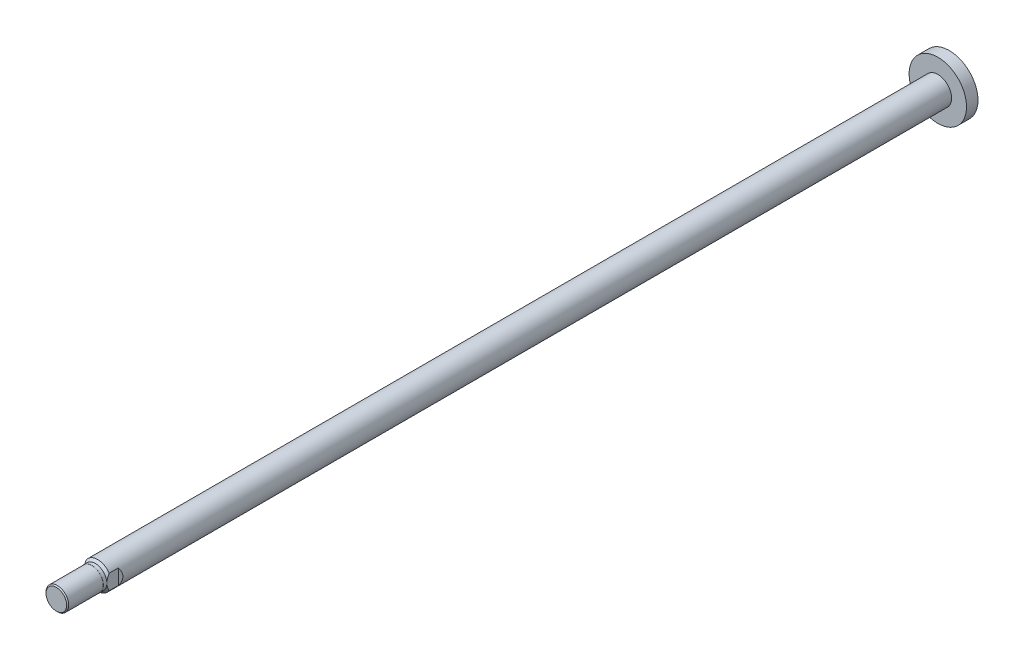
ISO-10303-21;
HEADER;
FILE_DESCRIPTION(('STEP AP214'),'2;1');
FILE_NAME('part.step','',(''),(''),'','','');
FILE_SCHEMA(('AUTOMOTIVE_DESIGN { 1 0 10303 214 1 1 1 1 }'));
ENDSEC;
DATA;
#1=APPLICATION_CONTEXT('core data for automotive mechanical design processes');
#2=APPLICATION_PROTOCOL_DEFINITION('international standard','automotive_design',2000,#1);
#3=PRODUCT_CONTEXT('',#1,'mechanical');
#4=PRODUCT('Part','Part','',(#3));
#5=PRODUCT_RELATED_PRODUCT_CATEGORY('part','',(#4));
#6=PRODUCT_DEFINITION_FORMATION('','',#4);
#7=PRODUCT_DEFINITION_CONTEXT('part definition',#1,'design');
#8=PRODUCT_DEFINITION('design','',#6,#7);
#9=PRODUCT_DEFINITION_SHAPE('','',#8);
#10=(LENGTH_UNIT() NAMED_UNIT(*) SI_UNIT(.MILLI.,.METRE.));
#11=(NAMED_UNIT(*) PLANE_ANGLE_UNIT() SI_UNIT($,.RADIAN.));
#12=(NAMED_UNIT(*) SI_UNIT($,.STERADIAN.) SOLID_ANGLE_UNIT());
#13=UNCERTAINTY_MEASURE_WITH_UNIT(LENGTH_MEASURE(1.E-05),#10,'distance_accuracy_value','');
#14=(GEOMETRIC_REPRESENTATION_CONTEXT(3) GLOBAL_UNCERTAINTY_ASSIGNED_CONTEXT((#13)) GLOBAL_UNIT_ASSIGNED_CONTEXT((#10,
#11,#12)) REPRESENTATION_CONTEXT('',''));
#15=CARTESIAN_POINT('',(0.,0.,0.));
#16=DIRECTION('',(0.,0.,1.));
#17=DIRECTION('',(1.,0.,0.));
#18=AXIS2_PLACEMENT_3D('',#15,#16,#17);
#19=CARTESIAN_POINT('',(0.,0.,371.));
#20=DIRECTION('',(0.,0.,1.));
#21=DIRECTION('',(1.,0.,0.));
#22=AXIS2_PLACEMENT_3D('',#19,#20,#21);
#23=CYLINDRICAL_SURFACE('',#22,5.);
#24=CARTESIAN_POINT('',(0.,0.,372.));
#25=DIRECTION('',(0.,0.,1.));
#26=DIRECTION('',(1.,0.,0.));
#27=AXIS2_PLACEMENT_3D('',#24,#25,#26);
#28=CIRCLE('',#27,5.);
#29=CARTESIAN_POINT('',(5.,0.,372.));
#30=VERTEX_POINT('',#29);
#31=CARTESIAN_POINT('',(-5.,0.,372.));
#32=VERTEX_POINT('',#31);
#33=EDGE_CURVE('E123',#30,#32,#28,.T.);
#34=ORIENTED_EDGE('',*,*,#33,.T.);
#35=EDGE_CURVE('E120',#32,#30,#28,.T.);
#36=ORIENTED_EDGE('',*,*,#35,.T.);
#37=EDGE_LOOP('',(#34,#36));
#38=FACE_BOUND('',#37,.T.);
#39=CARTESIAN_POINT('',(0.,0.,373.5));
#40=DIRECTION('',(0.,0.,1.));
#41=DIRECTION('',(1.,0.,0.));
#42=AXIS2_PLACEMENT_3D('',#39,#40,#41);
#43=CIRCLE('',#42,5.);
#44=CARTESIAN_POINT('',(5.,0.,373.5));
#45=VERTEX_POINT('',#44);
#46=EDGE_CURVE('E295',#45,#45,#43,.T.);
#47=ORIENTED_EDGE('',*,*,#46,.F.);
#48=EDGE_LOOP('',(#47));
#49=FACE_BOUND('',#48,.T.);
#50=ADVANCED_FACE('F36',(#38,#49),#23,.T.);
#51=CARTESIAN_POINT('',(0.,0.,389.));
#52=DIRECTION('',(0.,0.,-1.));
#53=DIRECTION('',(-1.,0.,0.));
#54=AXIS2_PLACEMENT_3D('',#51,#52,#53);
#55=CYLINDRICAL_SURFACE('',#54,6.);
#56=CARTESIAN_POINT('',(0.,0.,5.));
#57=DIRECTION('',(0.,0.,1.));
#58=DIRECTION('',(1.,0.,0.));
#59=AXIS2_PLACEMENT_3D('',#56,#57,#58);
#60=CIRCLE('',#59,6.);
#61=CARTESIAN_POINT('',(6.,0.,5.));
#62=VERTEX_POINT('',#61);
#63=EDGE_CURVE('E113',#62,#62,#60,.F.);
#64=ORIENTED_EDGE('',*,*,#63,.F.);
#65=EDGE_LOOP('',(#64));
#66=FACE_BOUND('',#65,.T.);
#67=CARTESIAN_POINT('',(0.,0.,372.));
#68=DIRECTION('',(-0.707106781186547,0.,0.707106781186547));
#69=DIRECTION('',(-0.707106781186548,0.,-0.707106781186548));
#70=AXIS2_PLACEMENT_3D('',#67,#68,#69);
#71=ELLIPSE('',#70,8.48528137423857,6.);
#72=CARTESIAN_POINT('',(-5.,3.3166247903554,367.));
#73=VERTEX_POINT('',#72);
#74=CARTESIAN_POINT('',(-5.,-3.3166247903554,367.));
#75=VERTEX_POINT('',#74);
#76=EDGE_CURVE('E45',#73,#75,#71,.T.);
#77=ORIENTED_EDGE('',*,*,#76,.F.);
#78=DIRECTION('',(0.,0.,-1.));
#79=VECTOR('',#78,1.);
#80=CARTESIAN_POINT('',(-5.,3.3166247903554,389.));
#81=LINE('',#80,#79);
#82=CARTESIAN_POINT('',(-5.,3.3166247903554,371.));
#83=VERTEX_POINT('',#82);
#84=EDGE_CURVE('E95',#83,#73,#81,.T.);
#85=ORIENTED_EDGE('',*,*,#84,.F.);
#86=CARTESIAN_POINT('',(0.,0.,371.));
#87=DIRECTION('',(0.,0.,1.));
#88=DIRECTION('',(1.,0.,0.));
#89=AXIS2_PLACEMENT_3D('',#86,#87,#88);
#90=CIRCLE('',#89,6.);
#91=CARTESIAN_POINT('',(5.,3.3166247903554,371.));
#92=VERTEX_POINT('',#91);
#93=EDGE_CURVE('E110',#92,#83,#90,.T.);
#94=ORIENTED_EDGE('',*,*,#93,.F.);
#95=DIRECTION('',(0.,0.,-1.));
#96=VECTOR('',#95,1.);
#97=CARTESIAN_POINT('',(5.,3.3166247903554,389.));
#98=LINE('',#97,#96);
#99=CARTESIAN_POINT('',(5.,3.31662479035539,367.));
#100=VERTEX_POINT('',#99);
#101=EDGE_CURVE('E60',#92,#100,#98,.T.);
#102=ORIENTED_EDGE('',*,*,#101,.T.);
#103=CARTESIAN_POINT('',(0.,0.,372.));
#104=DIRECTION('',(-0.707106781186547,0.,-0.707106781186547));
#105=DIRECTION('',(0.707106781186548,0.,-0.707106781186548));
#106=AXIS2_PLACEMENT_3D('',#103,#104,#105);
#107=ELLIPSE('',#106,8.48528137423857,6.);
#108=CARTESIAN_POINT('',(5.,-3.3166247903554,367.));
#109=VERTEX_POINT('',#108);
#110=EDGE_CURVE('E134',#100,#109,#107,.T.);
#111=ORIENTED_EDGE('',*,*,#110,.T.);
#112=DIRECTION('',(0.,0.,-1.));
#113=VECTOR('',#112,1.);
#114=CARTESIAN_POINT('',(5.,-3.3166247903554,389.));
#115=LINE('',#114,#113);
#116=CARTESIAN_POINT('',(5.,-3.3166247903554,371.));
#117=VERTEX_POINT('',#116);
#118=EDGE_CURVE('E107',#109,#117,#115,.F.);
#119=ORIENTED_EDGE('',*,*,#118,.T.);
#120=CARTESIAN_POINT('',(-5.,-3.3166247903554,371.));
#121=VERTEX_POINT('',#120);
#122=EDGE_CURVE('E100',#121,#117,#90,.T.);
#123=ORIENTED_EDGE('',*,*,#122,.F.);
#124=DIRECTION('',(0.,0.,-1.));
#125=VECTOR('',#124,1.);
#126=CARTESIAN_POINT('',(-5.,-3.3166247903554,389.));
#127=LINE('',#126,#125);
#128=EDGE_CURVE('E94',#75,#121,#127,.F.);
#129=ORIENTED_EDGE('',*,*,#128,.F.);
#130=EDGE_LOOP('',(#77,#85,#94,#102,#111,#119,#123,#129));
#131=FACE_BOUND('',#130,.T.);
#132=ADVANCED_FACE('F98',(#66,#131),#55,.T.);
#133=CARTESIAN_POINT('',(0.,0.,372.));
#134=DIRECTION('',(0.,0.,-1.));
#135=DIRECTION('',(-1.,0.,0.));
#136=AXIS2_PLACEMENT_3D('',#133,#134,#135);
#137=CONICAL_SURFACE('',#136,5.,0.785398163397423);
#138=CARTESIAN_POINT('',(-5.,-9.80732366992413,365.991657819333));
#139=CARTESIAN_POINT('',(-5.,-9.58119349300851,366.193085987174));
#140=CARTESIAN_POINT('',(-5.,-9.35437548737199,366.393749164528));
#141=CARTESIAN_POINT('',(-5.,-8.89899928524659,366.79313740836));
#142=CARTESIAN_POINT('',(-5.,-8.6704409122522,366.991862273468));
#143=CARTESIAN_POINT('',(-5.,-8.21030230656583,367.38775313156));
#144=CARTESIAN_POINT('',(-5.,-7.97871341756654,367.584909082702));
#145=CARTESIAN_POINT('',(-5.,-7.5130005734548,367.976186330086));
#146=CARTESIAN_POINT('',(-5.,-7.27887673726192,368.170307767648));
#147=CARTESIAN_POINT('',(-5.,-6.79333741200721,368.566229658539));
#148=CARTESIAN_POINT('',(-5.,-6.54172718160332,368.767792142821));
#149=CARTESIAN_POINT('',(-5.,-6.03402447950727,369.165175466891));
#150=CARTESIAN_POINT('',(-5.,-5.77793228571609,369.360996660662));
#151=CARTESIAN_POINT('',(-5.,-5.26038239641772,369.744561715338));
#152=CARTESIAN_POINT('',(-5.,-4.99893445821804,369.932318617863));
#153=CARTESIAN_POINT('',(-5.,-4.60117964050653,370.205763138088));
#154=CARTESIAN_POINT('',(-5.,-4.46768156464433,370.295535266308));
#155=CARTESIAN_POINT('',(-5.,-4.19854121941382,370.471799947519));
#156=CARTESIAN_POINT('',(-5.,-4.06289903271006,370.558292626512));
#157=CARTESIAN_POINT('',(-5.,-3.73331659881194,370.761840578153));
#158=CARTESIAN_POINT('',(-5.,-3.53817282002456,370.876965534501));
#159=CARTESIAN_POINT('',(-5.,-3.14206624253014,371.096996301087));
#160=CARTESIAN_POINT('',(-5.,-2.94110159442682,371.201898816227));
#161=CARTESIAN_POINT('',(-5.,-2.53432452563866,371.397211354502));
#162=CARTESIAN_POINT('',(-5.,-2.3285696517898,371.487739765282));
#163=CARTESIAN_POINT('',(-5.,-1.91010569546639,371.651027866697));
#164=CARTESIAN_POINT('',(-5.,-1.6974013599979,371.72379941032));
#165=CARTESIAN_POINT('',(-5.,-1.33583757944559,371.826512294549));
#166=CARTESIAN_POINT('',(-5.,-1.18875094094999,371.862683588712));
#167=CARTESIAN_POINT('',(-5.,-0.892133518622398,371.923106695163));
#168=CARTESIAN_POINT('',(-5.,-0.742603161385206,371.947360565362));
#169=CARTESIAN_POINT('',(-5.,-0.442508644222732,371.982659810919));
#170=CARTESIAN_POINT('',(-5.,-0.291950050232269,371.993751842159));
#171=CARTESIAN_POINT('',(-5.,0.00956074444691295,372.002261766408));
#172=CARTESIAN_POINT('',(-5.,0.160512946114289,371.999679625387));
#173=CARTESIAN_POINT('',(-5.,0.460821234122176,371.981036182964));
#174=CARTESIAN_POINT('',(-5.,0.610181520201681,371.965041367659));
#175=CARTESIAN_POINT('',(-5.,0.907029285461695,371.920517045255));
#176=CARTESIAN_POINT('',(-5.,1.05451631161975,371.89198456332));
#177=CARTESIAN_POINT('',(-5.,1.34850138164638,371.823342808497));
#178=CARTESIAN_POINT('',(-5.,1.49496927687971,371.783106006202));
#179=CARTESIAN_POINT('',(-5.,1.78477023425502,371.692793498149));
#180=CARTESIAN_POINT('',(-5.,1.92810386988379,371.642719609344));
#181=CARTESIAN_POINT('',(-5.,2.25856233596738,371.51632671444));
#182=CARTESIAN_POINT('',(-5.,2.44445833333597,371.436809418995));
#183=CARTESIAN_POINT('',(-5.,2.81095841816919,371.266314676252));
#184=CARTESIAN_POINT('',(-5.,2.99155953672339,371.175330945524));
#185=CARTESIAN_POINT('',(-5.,3.34862771216347,370.984146511687));
#186=CARTESIAN_POINT('',(-5.,3.52507723377714,370.883913316209));
#187=CARTESIAN_POINT('',(-5.,3.87377641180458,370.676511318682));
#188=CARTESIAN_POINT('',(-5.,4.04602687488211,370.569343863432));
#189=CARTESIAN_POINT('',(-5.,4.37848116977619,370.355018773358));
#190=CARTESIAN_POINT('',(-5.,4.5388573893564,370.24812715094));
#191=CARTESIAN_POINT('',(-5.,4.85688884269035,370.030355175925));
#192=CARTESIAN_POINT('',(-5.,5.01454385689172,369.919474503689));
#193=CARTESIAN_POINT('',(-5.,5.32613837107453,369.695473934197));
#194=CARTESIAN_POINT('',(-5.,5.48009839396283,369.582382486609));
#195=CARTESIAN_POINT('',(-5.,5.78600281061264,369.353586304537));
#196=CARTESIAN_POINT('',(-5.,5.93794772820797,369.237882271213));
#197=CARTESIAN_POINT('',(-5.,6.08906373093861,369.121123359296));
#198=B_SPLINE_CURVE_WITH_KNOTS('',3,(#138,#139,#140,#141,#142,#143,#144,#145,#146,#147,#148,
#149,#150,#151,#152,#153,#154,#155,#156,#157,#158,#159,#160,#161,#162,#163,#164,#165,#166,#167,
#168,#169,#170,#171,#172,#173,#174,#175,#176,#177,#178,#179,#180,#181,#182,#183,#184,#185,#186,
#187,#188,#189,#190,#191,#192,#193,#194,#195,#196,#197),.UNSPECIFIED.,.F.,.F.,(4,2,2,2,2,2,2,2,
2,2,2,2,2,2,2,2,2,2,2,2,2,2,2,2,2,2,2,2,2,4),(0.,0.908506034069066,1.81710546839297,
2.72951794396503,3.64188780027011,4.60899241639467,5.57603727884383,6.54145432686106,
7.02404000749891,7.50660712757976,8.18608499186118,8.86578115932427,9.53955092723023,
10.2128697052653,10.6668587549255,11.120769381751,11.5730661403057,12.0253640245159,
12.4754330488049,12.9256089195575,13.3808863969403,13.8360798614567,14.4421198260207,
15.0484933470257,15.6570845663808,16.2655579354673,16.8436881690068,17.421864831263,
17.9949317774412,18.5678467115505),.UNSPECIFIED.);
#199=EDGE_CURVE('E52',#121,#32,#198,.T.);
#200=ORIENTED_EDGE('',*,*,#199,.F.);
#201=ORIENTED_EDGE('',*,*,#122,.T.);
#202=CARTESIAN_POINT('',(5.,-9.80732366992413,365.991657819333));
#203=CARTESIAN_POINT('',(5.,-9.58119349300851,366.193085987174));
#204=CARTESIAN_POINT('',(5.,-9.35437548737199,366.393749164528));
#205=CARTESIAN_POINT('',(5.,-8.89899928524659,366.79313740836));
#206=CARTESIAN_POINT('',(5.,-8.6704409122522,366.991862273468));
#207=CARTESIAN_POINT('',(5.,-8.21030230656583,367.38775313156));
#208=CARTESIAN_POINT('',(5.,-7.97871341756654,367.584909082702));
#209=CARTESIAN_POINT('',(5.,-7.5130005734548,367.976186330086));
#210=CARTESIAN_POINT('',(5.,-7.27887673726192,368.170307767648));
#211=CARTESIAN_POINT('',(5.,-6.79333741200721,368.566229658539));
#212=CARTESIAN_POINT('',(5.,-6.54172718160332,368.767792142821));
#213=CARTESIAN_POINT('',(5.,-6.03402447950727,369.165175466891));
#214=CARTESIAN_POINT('',(5.,-5.77793228571609,369.360996660662));
#215=CARTESIAN_POINT('',(5.,-5.26038239641772,369.744561715338));
#216=CARTESIAN_POINT('',(5.,-4.99893445821804,369.932318617863));
#217=CARTESIAN_POINT('',(5.,-4.60117964050653,370.205763138088));
#218=CARTESIAN_POINT('',(5.,-4.46768156464433,370.295535266308));
#219=CARTESIAN_POINT('',(5.,-4.19854121941382,370.471799947519));
#220=CARTESIAN_POINT('',(5.,-4.06289903271006,370.558292626512));
#221=CARTESIAN_POINT('',(5.,-3.73331659881194,370.761840578153));
#222=CARTESIAN_POINT('',(5.,-3.53817282002456,370.876965534501));
#223=CARTESIAN_POINT('',(5.,-3.14206624253014,371.096996301087));
#224=CARTESIAN_POINT('',(5.,-2.94110159442682,371.201898816227));
#225=CARTESIAN_POINT('',(5.,-2.53432452563866,371.397211354502));
#226=CARTESIAN_POINT('',(5.,-2.3285696517898,371.487739765282));
#227=CARTESIAN_POINT('',(5.,-1.91010569546639,371.651027866697));
#228=CARTESIAN_POINT('',(5.,-1.6974013599979,371.72379941032));
#229=CARTESIAN_POINT('',(5.,-1.33583757944559,371.826512294549));
#230=CARTESIAN_POINT('',(5.,-1.18875094094999,371.862683588712));
#231=CARTESIAN_POINT('',(5.,-0.892133518622398,371.923106695163));
#232=CARTESIAN_POINT('',(5.,-0.742603161385206,371.947360565362));
#233=CARTESIAN_POINT('',(5.,-0.442508644222732,371.982659810919));
#234=CARTESIAN_POINT('',(5.,-0.291950050232269,371.993751842159));
#235=CARTESIAN_POINT('',(5.,0.00956074444691295,372.002261766408));
#236=CARTESIAN_POINT('',(5.,0.160512946114289,371.999679625387));
#237=CARTESIAN_POINT('',(5.,0.460821234122176,371.981036182964));
#238=CARTESIAN_POINT('',(5.,0.610181520201681,371.965041367659));
#239=CARTESIAN_POINT('',(5.,0.907029285461695,371.920517045255));
#240=CARTESIAN_POINT('',(5.,1.05451631161975,371.89198456332));
#241=CARTESIAN_POINT('',(5.,1.34850138164638,371.823342808497));
#242=CARTESIAN_POINT('',(5.,1.49496927687971,371.783106006202));
#243=CARTESIAN_POINT('',(5.,1.78477023425502,371.692793498149));
#244=CARTESIAN_POINT('',(5.,1.92810386988379,371.642719609344));
#245=CARTESIAN_POINT('',(5.,2.25856233596738,371.51632671444));
#246=CARTESIAN_POINT('',(5.,2.44445833333597,371.436809418995));
#247=CARTESIAN_POINT('',(5.,2.81095841816919,371.266314676252));
#248=CARTESIAN_POINT('',(5.,2.99155953672339,371.175330945524));
#249=CARTESIAN_POINT('',(5.,3.34862771216347,370.984146511687));
#250=CARTESIAN_POINT('',(5.,3.52507723377714,370.883913316209));
#251=CARTESIAN_POINT('',(5.,3.87377641180458,370.676511318682));
#252=CARTESIAN_POINT('',(5.,4.04602687488211,370.569343863432));
#253=CARTESIAN_POINT('',(5.,4.37848116977619,370.355018773358));
#254=CARTESIAN_POINT('',(5.,4.5388573893564,370.24812715094));
#255=CARTESIAN_POINT('',(5.,4.85688884269035,370.030355175925));
#256=CARTESIAN_POINT('',(5.,5.01454385689172,369.919474503689));
#257=CARTESIAN_POINT('',(5.,5.32613837107453,369.695473934197));
#258=CARTESIAN_POINT('',(5.,5.48009839396283,369.582382486609));
#259=CARTESIAN_POINT('',(5.,5.78600281061264,369.353586304537));
#260=CARTESIAN_POINT('',(5.,5.93794772820797,369.237882271213));
#261=CARTESIAN_POINT('',(5.,6.08906373093861,369.121123359296));
#262=B_SPLINE_CURVE_WITH_KNOTS('',3,(#202,#203,#204,#205,#206,#207,#208,#209,#210,#211,#212,
#213,#214,#215,#216,#217,#218,#219,#220,#221,#222,#223,#224,#225,#226,#227,#228,#229,#230,#231,
#232,#233,#234,#235,#236,#237,#238,#239,#240,#241,#242,#243,#244,#245,#246,#247,#248,#249,#250,
#251,#252,#253,#254,#255,#256,#257,#258,#259,#260,#261),.UNSPECIFIED.,.F.,.F.,(4,2,2,2,2,2,2,2,
2,2,2,2,2,2,2,2,2,2,2,2,2,2,2,2,2,2,2,2,2,4),(0.,0.908506034069066,1.81710546839297,
2.72951794396503,3.64188780027011,4.60899241639467,5.57603727884383,6.54145432686106,
7.02404000749891,7.50660712757976,8.18608499186118,8.86578115932427,9.53955092723023,
10.2128697052653,10.6668587549255,11.120769381751,11.5730661403057,12.0253640245159,
12.4754330488049,12.9256089195575,13.3808863969403,13.8360798614567,14.4421198260207,
15.0484933470257,15.6570845663808,16.2655579354673,16.8436881690068,17.421864831263,
17.9949317774412,18.5678467115505),.UNSPECIFIED.);
#263=EDGE_CURVE('E133',#117,#30,#262,.T.);
#264=ORIENTED_EDGE('',*,*,#263,.T.);
#265=ORIENTED_EDGE('',*,*,#35,.F.);
#266=EDGE_LOOP('',(#200,#201,#264,#265));
#267=FACE_BOUND('',#266,.T.);
#268=ADVANCED_FACE('F136',(#267),#137,.T.);
#269=EDGE_CURVE('E287',#32,#83,#198,.T.);
#270=ORIENTED_EDGE('',*,*,#269,.F.);
#271=ORIENTED_EDGE('',*,*,#33,.F.);
#272=EDGE_CURVE('E126',#30,#92,#262,.T.);
#273=ORIENTED_EDGE('',*,*,#272,.T.);
#274=ORIENTED_EDGE('',*,*,#93,.T.);
#275=EDGE_LOOP('',(#270,#271,#273,#274));
#276=FACE_BOUND('',#275,.T.);
#277=ADVANCED_FACE('F166',(#276),#137,.T.);
#278=CARTESIAN_POINT('',(0.,0.,5.));
#279=DIRECTION('',(0.,0.,1.));
#280=DIRECTION('',(1.,0.,0.));
#281=AXIS2_PLACEMENT_3D('',#278,#279,#280);
#282=PLANE('',#281);
#283=CARTESIAN_POINT('',(0.,0.,5.));
#284=DIRECTION('',(0.,0.,1.));
#285=DIRECTION('',(1.,0.,0.));
#286=AXIS2_PLACEMENT_3D('',#283,#284,#285);
#287=CIRCLE('',#286,12.5);
#288=CARTESIAN_POINT('',(12.5,0.,5.));
#289=VERTEX_POINT('',#288);
#290=EDGE_CURVE('E117',#289,#289,#287,.T.);
#291=ORIENTED_EDGE('',*,*,#290,.T.);
#292=EDGE_LOOP('',(#291));
#293=FACE_BOUND('',#292,.T.);
#294=ORIENTED_EDGE('',*,*,#63,.T.);
#295=EDGE_LOOP('',(#294));
#296=FACE_BOUND('',#295,.T.);
#297=ADVANCED_FACE('F162',(#293,#296),#282,.T.);
#298=CARTESIAN_POINT('',(0.,0.,5.));
#299=DIRECTION('',(0.,0.,-1.));
#300=DIRECTION('',(-1.,0.,0.));
#301=AXIS2_PLACEMENT_3D('',#298,#299,#300);
#302=CYLINDRICAL_SURFACE('',#301,12.5);
#303=ORIENTED_EDGE('',*,*,#290,.F.);
#304=EDGE_LOOP('',(#303));
#305=FACE_BOUND('',#304,.T.);
#306=CARTESIAN_POINT('',(0.,0.,0.));
#307=DIRECTION('',(0.,0.,1.));
#308=DIRECTION('',(1.,0.,0.));
#309=AXIS2_PLACEMENT_3D('',#306,#307,#308);
#310=CIRCLE('',#309,12.5);
#311=CARTESIAN_POINT('',(12.5,0.,0.));
#312=VERTEX_POINT('',#311);
#313=EDGE_CURVE('E116',#312,#312,#310,.T.);
#314=ORIENTED_EDGE('',*,*,#313,.T.);
#315=EDGE_LOOP('',(#314));
#316=FACE_BOUND('',#315,.T.);
#317=ADVANCED_FACE('F165',(#305,#316),#302,.T.);
#318=CARTESIAN_POINT('',(0.,0.,0.));
#319=DIRECTION('',(0.,0.,1.));
#320=DIRECTION('',(1.,0.,0.));
#321=AXIS2_PLACEMENT_3D('',#318,#319,#320);
#322=PLANE('',#321);
#323=ORIENTED_EDGE('',*,*,#313,.F.);
#324=EDGE_LOOP('',(#323));
#325=FACE_BOUND('',#324,.T.);
#326=ADVANCED_FACE('F149',(#325),#322,.F.);
#327=CARTESIAN_POINT('',(5.,-12.5,367.));
#328=DIRECTION('',(-0.707106781186547,0.,-0.707106781186547));
#329=DIRECTION('',(-0.707106781186548,0.,0.707106781186548));
#330=AXIS2_PLACEMENT_3D('',#327,#328,#329);
#331=PLANE('',#330);
#332=ORIENTED_EDGE('',*,*,#110,.F.);
#333=DIRECTION('',(0.,1.,0.));
#334=VECTOR('',#333,1.);
#335=CARTESIAN_POINT('',(5.,-12.5,367.));
#336=LINE('',#335,#334);
#337=EDGE_CURVE('E102',#109,#100,#336,.T.);
#338=ORIENTED_EDGE('',*,*,#337,.F.);
#339=EDGE_LOOP('',(#332,#338));
#340=FACE_BOUND('',#339,.T.);
#341=ADVANCED_FACE('F144',(#340),#331,.F.);
#342=CARTESIAN_POINT('',(5.,-12.5,372.));
#343=DIRECTION('',(-1.,0.,0.));
#344=DIRECTION('',(0.,0.,1.));
#345=AXIS2_PLACEMENT_3D('',#342,#343,#344);
#346=PLANE('',#345);
#347=ORIENTED_EDGE('',*,*,#272,.F.);
#348=ORIENTED_EDGE('',*,*,#263,.F.);
#349=ORIENTED_EDGE('',*,*,#118,.F.);
#350=ORIENTED_EDGE('',*,*,#337,.T.);
#351=ORIENTED_EDGE('',*,*,#101,.F.);
#352=EDGE_LOOP('',(#347,#348,#349,#350,#351));
#353=FACE_BOUND('',#352,.T.);
#354=ADVANCED_FACE('F139',(#353),#346,.F.);
#355=CARTESIAN_POINT('',(-5.,-12.5,367.));
#356=DIRECTION('',(-0.707106781186547,0.,0.707106781186547));
#357=DIRECTION('',(0.707106781186548,0.,0.707106781186548));
#358=AXIS2_PLACEMENT_3D('',#355,#356,#357);
#359=PLANE('',#358);
#360=ORIENTED_EDGE('',*,*,#76,.T.);
#361=DIRECTION('',(0.,1.,0.));
#362=VECTOR('',#361,1.);
#363=CARTESIAN_POINT('',(-5.,-12.5,367.));
#364=LINE('',#363,#362);
#365=EDGE_CURVE('E87',#75,#73,#364,.T.);
#366=ORIENTED_EDGE('',*,*,#365,.T.);
#367=EDGE_LOOP('',(#360,#366));
#368=FACE_BOUND('',#367,.T.);
#369=ADVANCED_FACE('F86',(#368),#359,.T.);
#370=CARTESIAN_POINT('',(-5.,-12.5,372.));
#371=DIRECTION('',(-1.,0.,0.));
#372=DIRECTION('',(0.,0.,1.));
#373=AXIS2_PLACEMENT_3D('',#370,#371,#372);
#374=PLANE('',#373);
#375=ORIENTED_EDGE('',*,*,#84,.T.);
#376=ORIENTED_EDGE('',*,*,#365,.F.);
#377=ORIENTED_EDGE('',*,*,#128,.T.);
#378=ORIENTED_EDGE('',*,*,#199,.T.);
#379=ORIENTED_EDGE('',*,*,#269,.T.);
#380=EDGE_LOOP('',(#375,#376,#377,#378,#379));
#381=FACE_BOUND('',#380,.T.);
#382=ADVANCED_FACE('F93',(#381),#374,.T.);
#383=CARTESIAN_POINT('',(0.,0.,373.5));
#384=DIRECTION('',(0.,0.,1.));
#385=DIRECTION('',(1.,0.,0.));
#386=AXIS2_PLACEMENT_3D('',#383,#384,#385);
#387=PLANE('',#386);
#388=CARTESIAN_POINT('',(0.,0.,373.5));
#389=DIRECTION('',(0.,0.,1.));
#390=DIRECTION('',(1.,0.,0.));
#391=AXIS2_PLACEMENT_3D('',#388,#389,#390);
#392=CIRCLE('',#391,4.95);
#393=CARTESIAN_POINT('',(4.95,0.,373.5));
#394=VERTEX_POINT('',#393);
#395=EDGE_CURVE('E297',#394,#394,#392,.T.);
#396=ORIENTED_EDGE('',*,*,#395,.F.);
#397=EDGE_LOOP('',(#396));
#398=FACE_BOUND('',#397,.T.);
#399=ORIENTED_EDGE('',*,*,#46,.T.);
#400=EDGE_LOOP('',(#399));
#401=FACE_BOUND('',#400,.T.);
#402=ADVANCED_FACE('F206',(#398,#401),#387,.T.);
#403=CARTESIAN_POINT('',(0.,0.,373.5));
#404=DIRECTION('',(0.,0.,1.));
#405=DIRECTION('',(1.,0.,0.));
#406=AXIS2_PLACEMENT_3D('',#403,#404,#405);
#407=CYLINDRICAL_SURFACE('',#406,4.95);
#408=CARTESIAN_POINT('',(0.,0.,388.55));
#409=DIRECTION('',(0.,0.,-1.));
#410=DIRECTION('',(-1.,0.,0.));
#411=AXIS2_PLACEMENT_3D('',#408,#409,#410);
#412=CIRCLE('',#411,4.95);
#413=CARTESIAN_POINT('',(-4.95,0.,388.55));
#414=VERTEX_POINT('',#413);
#415=EDGE_CURVE('E40',#414,#414,#412,.F.);
#416=ORIENTED_EDGE('',*,*,#415,.F.);
#417=EDGE_LOOP('',(#416));
#418=FACE_BOUND('',#417,.T.);
#419=ORIENTED_EDGE('',*,*,#395,.T.);
#420=EDGE_LOOP('',(#419));
#421=FACE_BOUND('',#420,.T.);
#422=ADVANCED_FACE('F157',(#418,#421),#407,.T.);
#423=CARTESIAN_POINT('',(0.,0.,389.));
#424=DIRECTION('',(0.,0.,1.));
#425=DIRECTION('',(1.,0.,0.));
#426=AXIS2_PLACEMENT_3D('',#423,#424,#425);
#427=PLANE('',#426);
#428=CARTESIAN_POINT('',(0.,0.,389.));
#429=DIRECTION('',(0.,0.,1.));
#430=DIRECTION('',(1.,0.,0.));
#431=AXIS2_PLACEMENT_3D('',#428,#429,#430);
#432=CIRCLE('',#431,4.5);
#433=CARTESIAN_POINT('',(4.5,0.,389.));
#434=VERTEX_POINT('',#433);
#435=EDGE_CURVE('E11',#434,#434,#432,.T.);
#436=ORIENTED_EDGE('',*,*,#435,.T.);
#437=EDGE_LOOP('',(#436));
#438=FACE_BOUND('',#437,.T.);
#439=ADVANCED_FACE('F154',(#438),#427,.T.);
#440=CARTESIAN_POINT('',(0.,0.,389.));
#441=DIRECTION('',(0.,0.,-1.));
#442=DIRECTION('',(-1.,0.,0.));
#443=AXIS2_PLACEMENT_3D('',#440,#441,#442);
#444=CONICAL_SURFACE('',#443,4.5,0.785398163397444);
#445=ORIENTED_EDGE('',*,*,#435,.F.);
#446=EDGE_LOOP('',(#445));
#447=FACE_BOUND('',#446,.T.);
#448=ORIENTED_EDGE('',*,*,#415,.T.);
#449=EDGE_LOOP('',(#448));
#450=FACE_BOUND('',#449,.T.);
#451=ADVANCED_FACE('F38',(#447,#450),#444,.T.);
#452=CLOSED_SHELL('',(#50,#132,#268,#277,#297,#317,#326,#341,#354,#369,#382,#402,#422,#439,#451));
#453=MANIFOLD_SOLID_BREP('B2',#452);
#454=ADVANCED_BREP_SHAPE_REPRESENTATION('',(#18,#453),#14);
#455=SHAPE_DEFINITION_REPRESENTATION(#9,#454);
ENDSEC;
END-ISO-10303-21;
